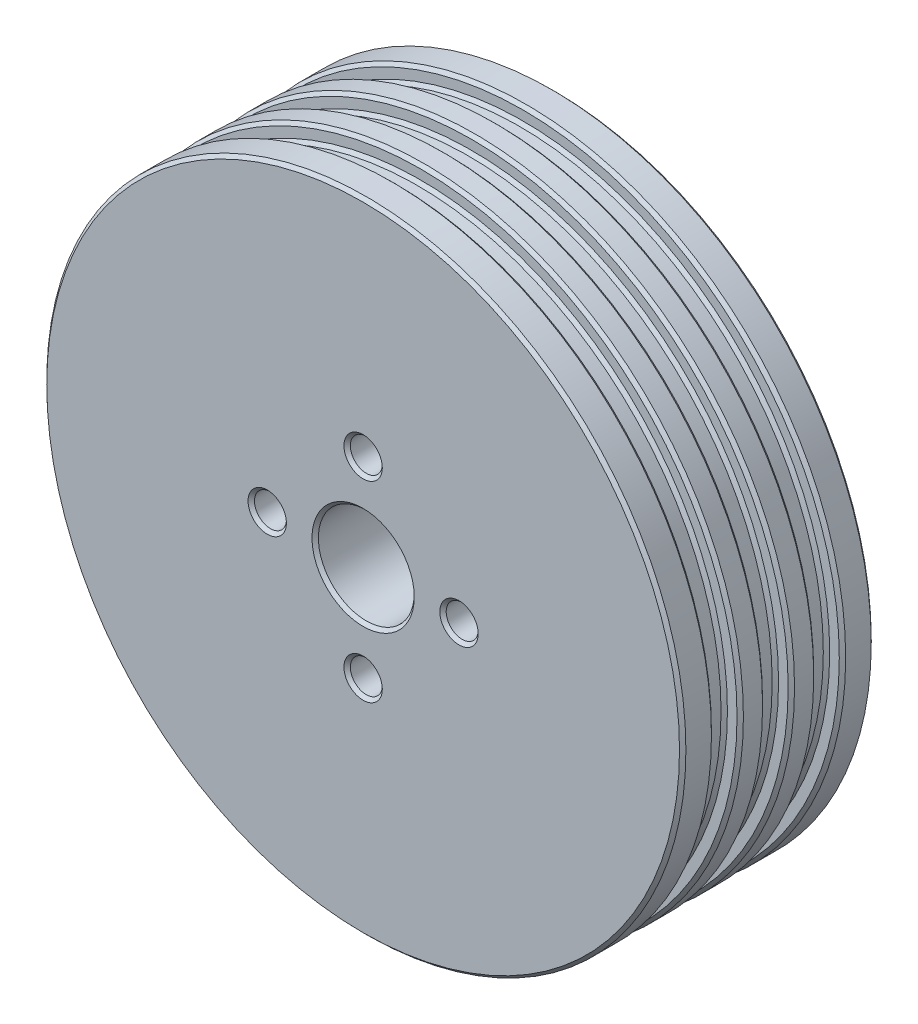
ISO-10303-21;
HEADER;
FILE_DESCRIPTION(('STEP AP214'),'2;1');
FILE_NAME('part.step','',(''),(''),'','','');
FILE_SCHEMA(('AUTOMOTIVE_DESIGN { 1 0 10303 214 1 1 1 1 }'));
ENDSEC;
DATA;
#1=APPLICATION_CONTEXT('core data for automotive mechanical design processes');
#2=APPLICATION_PROTOCOL_DEFINITION('international standard','automotive_design',2000,#1);
#3=PRODUCT_CONTEXT('',#1,'mechanical');
#4=PRODUCT('Part','Part','',(#3));
#5=PRODUCT_RELATED_PRODUCT_CATEGORY('part','',(#4));
#6=PRODUCT_DEFINITION_FORMATION('','',#4);
#7=PRODUCT_DEFINITION_CONTEXT('part definition',#1,'design');
#8=PRODUCT_DEFINITION('design','',#6,#7);
#9=PRODUCT_DEFINITION_SHAPE('','',#8);
#10=(LENGTH_UNIT() NAMED_UNIT(*) SI_UNIT(.MILLI.,.METRE.));
#11=(NAMED_UNIT(*) PLANE_ANGLE_UNIT() SI_UNIT($,.RADIAN.));
#12=(NAMED_UNIT(*) SI_UNIT($,.STERADIAN.) SOLID_ANGLE_UNIT());
#13=UNCERTAINTY_MEASURE_WITH_UNIT(LENGTH_MEASURE(1.E-05),#10,'distance_accuracy_value','');
#14=(GEOMETRIC_REPRESENTATION_CONTEXT(3) GLOBAL_UNCERTAINTY_ASSIGNED_CONTEXT((#13)) GLOBAL_UNIT_ASSIGNED_CONTEXT((#10,
#11,#12)) REPRESENTATION_CONTEXT('',''));
#15=CARTESIAN_POINT('',(0.,0.,0.));
#16=DIRECTION('',(0.,0.,1.));
#17=DIRECTION('',(1.,0.,0.));
#18=AXIS2_PLACEMENT_3D('',#15,#16,#17);
#19=CARTESIAN_POINT('',(0.,0.,34.));
#20=DIRECTION('',(0.,0.,1.));
#21=DIRECTION('',(1.,0.,0.));
#22=AXIS2_PLACEMENT_3D('',#19,#20,#21);
#23=PLANE('',#22);
#24=CARTESIAN_POINT('',(0.,0.,34.));
#25=DIRECTION('',(0.,0.,1.));
#26=DIRECTION('',(1.,0.,0.));
#27=AXIS2_PLACEMENT_3D('',#24,#25,#26);
#28=CIRCLE('',#27,99.);
#29=CARTESIAN_POINT('',(99.,0.,34.));
#30=VERTEX_POINT('',#29);
#31=EDGE_CURVE('E19',#30,#30,#28,.T.);
#32=ORIENTED_EDGE('',*,*,#31,.F.);
#33=EDGE_LOOP('',(#32));
#34=FACE_BOUND('',#33,.T.);
#35=CARTESIAN_POINT('',(0.,0.,34.));
#36=DIRECTION('',(0.,0.,1.));
#37=DIRECTION('',(1.,0.,0.));
#38=AXIS2_PLACEMENT_3D('',#35,#36,#37);
#39=CIRCLE('',#38,96.);
#40=CARTESIAN_POINT('',(96.,0.,34.));
#41=VERTEX_POINT('',#40);
#42=EDGE_CURVE('E42',#41,#41,#39,.T.);
#43=ORIENTED_EDGE('',*,*,#42,.T.);
#44=EDGE_LOOP('',(#43));
#45=FACE_BOUND('',#44,.T.);
#46=ADVANCED_FACE('F16',(#34,#45),#23,.F.);
#47=CARTESIAN_POINT('',(0.,0.,35.));
#48=DIRECTION('',(0.,0.,1.));
#49=DIRECTION('',(1.,0.,0.));
#50=AXIS2_PLACEMENT_3D('',#47,#48,#49);
#51=CONICAL_SURFACE('',#50,100.,0.785398163397);
#52=ORIENTED_EDGE('',*,*,#31,.T.);
#53=DIRECTION('',(-0.707106781186548,0.,-0.707106781186548));
#54=VECTOR('',#53,1.);
#55=CARTESIAN_POINT('',(100.,0.,35.));
#56=LINE('',#55,#54);
#57=CARTESIAN_POINT('',(100.,0.,35.));
#58=VERTEX_POINT('',#57);
#59=EDGE_CURVE('E10',#58,#30,#56,.T.);
#60=ORIENTED_EDGE('',*,*,#59,.F.);
#61=CARTESIAN_POINT('',(0.,0.,35.));
#62=DIRECTION('',(0.,0.,1.));
#63=DIRECTION('',(1.,0.,0.));
#64=AXIS2_PLACEMENT_3D('',#61,#62,#63);
#65=CIRCLE('',#64,100.);
#66=EDGE_CURVE('E485',#58,#58,#65,.T.);
#67=ORIENTED_EDGE('',*,*,#66,.F.);
#68=ORIENTED_EDGE('',*,*,#59,.T.);
#69=EDGE_LOOP('',(#52,#60,#67,#68));
#70=FACE_BOUND('',#69,.T.);
#71=ADVANCED_FACE('F520',(#70),#51,.T.);
#72=CARTESIAN_POINT('',(0.,0.,33.));
#73=DIRECTION('',(0.,0.,1.));
#74=DIRECTION('',(1.,0.,0.));
#75=AXIS2_PLACEMENT_3D('',#72,#73,#74);
#76=CONICAL_SURFACE('',#75,95.,0.785398163397);
#77=DIRECTION('',(0.707106781186548,0.,0.707106781186548));
#78=VECTOR('',#77,1.);
#79=CARTESIAN_POINT('',(95.,0.,33.));
#80=LINE('',#79,#78);
#81=CARTESIAN_POINT('',(95.,0.,33.));
#82=VERTEX_POINT('',#81);
#83=EDGE_CURVE('E288',#82,#41,#80,.T.);
#84=ORIENTED_EDGE('',*,*,#83,.F.);
#85=CARTESIAN_POINT('',(0.,0.,33.));
#86=DIRECTION('',(0.,0.,1.));
#87=DIRECTION('',(1.,0.,0.));
#88=AXIS2_PLACEMENT_3D('',#85,#86,#87);
#89=CIRCLE('',#88,95.);
#90=EDGE_CURVE('E253',#82,#82,#89,.T.);
#91=ORIENTED_EDGE('',*,*,#90,.T.);
#92=ORIENTED_EDGE('',*,*,#83,.T.);
#93=ORIENTED_EDGE('',*,*,#42,.F.);
#94=EDGE_LOOP('',(#84,#91,#92,#93));
#95=FACE_BOUND('',#94,.T.);
#96=ADVANCED_FACE('F743',(#95),#76,.T.);
#97=CARTESIAN_POINT('',(0.,0.,34.));
#98=DIRECTION('',(0.,0.,1.));
#99=DIRECTION('',(1.,0.,0.));
#100=AXIS2_PLACEMENT_3D('',#97,#98,#99);
#101=CYLINDRICAL_SURFACE('',#100,100.);
#102=DIRECTION('',(0.,0.,1.));
#103=VECTOR('',#102,1.);
#104=CARTESIAN_POINT('',(100.,0.,34.));
#105=LINE('',#104,#103);
#106=CARTESIAN_POINT('',(100.,0.,41.));
#107=VERTEX_POINT('',#106);
#108=EDGE_CURVE('E256',#58,#107,#105,.T.);
#109=ORIENTED_EDGE('',*,*,#108,.F.);
#110=ORIENTED_EDGE('',*,*,#66,.T.);
#111=ORIENTED_EDGE('',*,*,#108,.T.);
#112=CARTESIAN_POINT('',(0.,0.,41.));
#113=DIRECTION('',(0.,0.,1.));
#114=DIRECTION('',(1.,0.,0.));
#115=AXIS2_PLACEMENT_3D('',#112,#113,#114);
#116=CIRCLE('',#115,100.);
#117=EDGE_CURVE('E448',#107,#107,#116,.T.);
#118=ORIENTED_EDGE('',*,*,#117,.F.);
#119=EDGE_LOOP('',(#109,#110,#111,#118));
#120=FACE_BOUND('',#119,.T.);
#121=ADVANCED_FACE('F518',(#120),#101,.T.);
#122=CARTESIAN_POINT('',(0.,0.,26.));
#123=DIRECTION('',(0.,0.,1.));
#124=DIRECTION('',(1.,0.,0.));
#125=AXIS2_PLACEMENT_3D('',#122,#123,#124);
#126=CYLINDRICAL_SURFACE('',#125,95.);
#127=DIRECTION('',(0.,0.,1.));
#128=VECTOR('',#127,1.);
#129=CARTESIAN_POINT('',(95.,0.,26.));
#130=LINE('',#129,#128);
#131=CARTESIAN_POINT('',(95.,0.,27.));
#132=VERTEX_POINT('',#131);
#133=EDGE_CURVE('E257',#132,#82,#130,.T.);
#134=ORIENTED_EDGE('',*,*,#133,.F.);
#135=CARTESIAN_POINT('',(0.,0.,27.));
#136=DIRECTION('',(0.,0.,1.));
#137=DIRECTION('',(1.,0.,0.));
#138=AXIS2_PLACEMENT_3D('',#135,#136,#137);
#139=CIRCLE('',#138,95.);
#140=EDGE_CURVE('E268',#132,#132,#139,.T.);
#141=ORIENTED_EDGE('',*,*,#140,.T.);
#142=ORIENTED_EDGE('',*,*,#133,.T.);
#143=ORIENTED_EDGE('',*,*,#90,.F.);
#144=EDGE_LOOP('',(#134,#141,#142,#143));
#145=FACE_BOUND('',#144,.T.);
#146=ADVANCED_FACE('F884',(#145),#126,.T.);
#147=CARTESIAN_POINT('',(0.,0.,41.));
#148=DIRECTION('',(0.,0.,-1.));
#149=DIRECTION('',(1.,0.,0.));
#150=AXIS2_PLACEMENT_3D('',#147,#148,#149);
#151=CONICAL_SURFACE('',#150,100.,0.785398163397);
#152=ORIENTED_EDGE('',*,*,#117,.T.);
#153=DIRECTION('',(0.707106781186548,0.,-0.707106781186548));
#154=VECTOR('',#153,1.);
#155=CARTESIAN_POINT('',(100.,0.,41.));
#156=LINE('',#155,#154);
#157=CARTESIAN_POINT('',(99.,0.,42.));
#158=VERTEX_POINT('',#157);
#159=EDGE_CURVE('E452',#158,#107,#156,.T.);
#160=ORIENTED_EDGE('',*,*,#159,.F.);
#161=CARTESIAN_POINT('',(0.,0.,42.));
#162=DIRECTION('',(0.,0.,1.));
#163=DIRECTION('',(1.,0.,0.));
#164=AXIS2_PLACEMENT_3D('',#161,#162,#163);
#165=CIRCLE('',#164,99.);
#166=EDGE_CURVE('E269',#158,#158,#165,.T.);
#167=ORIENTED_EDGE('',*,*,#166,.F.);
#168=ORIENTED_EDGE('',*,*,#159,.T.);
#169=EDGE_LOOP('',(#152,#160,#167,#168));
#170=FACE_BOUND('',#169,.T.);
#171=ADVANCED_FACE('F875',(#170),#151,.T.);
#172=CARTESIAN_POINT('',(0.,0.,27.));
#173=DIRECTION('',(0.,0.,-1.));
#174=DIRECTION('',(1.,0.,0.));
#175=AXIS2_PLACEMENT_3D('',#172,#173,#174);
#176=CONICAL_SURFACE('',#175,95.,0.785398163397);
#177=DIRECTION('',(-0.707106781186548,0.,0.707106781186548));
#178=VECTOR('',#177,1.);
#179=CARTESIAN_POINT('',(95.,0.,27.));
#180=LINE('',#179,#178);
#181=CARTESIAN_POINT('',(96.,0.,26.));
#182=VERTEX_POINT('',#181);
#183=EDGE_CURVE('E264',#182,#132,#180,.T.);
#184=ORIENTED_EDGE('',*,*,#183,.F.);
#185=CARTESIAN_POINT('',(0.,0.,26.));
#186=DIRECTION('',(0.,0.,1.));
#187=DIRECTION('',(1.,0.,0.));
#188=AXIS2_PLACEMENT_3D('',#185,#186,#187);
#189=CIRCLE('',#188,96.);
#190=EDGE_CURVE('E489',#182,#182,#189,.T.);
#191=ORIENTED_EDGE('',*,*,#190,.T.);
#192=ORIENTED_EDGE('',*,*,#183,.T.);
#193=ORIENTED_EDGE('',*,*,#140,.F.);
#194=EDGE_LOOP('',(#184,#191,#192,#193));
#195=FACE_BOUND('',#194,.T.);
#196=ADVANCED_FACE('F866',(#195),#176,.T.);
#197=CARTESIAN_POINT('',(0.,0.,42.));
#198=DIRECTION('',(0.,0.,1.));
#199=DIRECTION('',(1.,0.,0.));
#200=AXIS2_PLACEMENT_3D('',#197,#198,#199);
#201=PLANE('',#200);
#202=ORIENTED_EDGE('',*,*,#166,.T.);
#203=EDGE_LOOP('',(#202));
#204=FACE_BOUND('',#203,.T.);
#205=CARTESIAN_POINT('',(0.,0.,42.));
#206=DIRECTION('',(0.,0.,1.));
#207=DIRECTION('',(1.,0.,0.));
#208=AXIS2_PLACEMENT_3D('',#205,#206,#207);
#209=CIRCLE('',#208,96.);
#210=CARTESIAN_POINT('',(96.,0.,42.));
#211=VERTEX_POINT('',#210);
#212=EDGE_CURVE('E492',#211,#211,#209,.T.);
#213=ORIENTED_EDGE('',*,*,#212,.F.);
#214=EDGE_LOOP('',(#213));
#215=FACE_BOUND('',#214,.T.);
#216=ADVANCED_FACE('F857',(#204,#215),#201,.T.);
#217=CARTESIAN_POINT('',(0.,0.,26.));
#218=DIRECTION('',(0.,0.,1.));
#219=DIRECTION('',(1.,0.,0.));
#220=AXIS2_PLACEMENT_3D('',#217,#218,#219);
#221=PLANE('',#220);
#222=ORIENTED_EDGE('',*,*,#190,.F.);
#223=EDGE_LOOP('',(#222));
#224=FACE_BOUND('',#223,.T.);
#225=CARTESIAN_POINT('',(0.,0.,26.));
#226=DIRECTION('',(0.,0.,1.));
#227=DIRECTION('',(1.,0.,0.));
#228=AXIS2_PLACEMENT_3D('',#225,#226,#227);
#229=CIRCLE('',#228,99.);
#230=CARTESIAN_POINT('',(99.,0.,26.));
#231=VERTEX_POINT('',#230);
#232=EDGE_CURVE('E481',#231,#231,#229,.T.);
#233=ORIENTED_EDGE('',*,*,#232,.T.);
#234=EDGE_LOOP('',(#233));
#235=FACE_BOUND('',#234,.T.);
#236=ADVANCED_FACE('F848',(#224,#235),#221,.T.);
#237=CARTESIAN_POINT('',(0.,0.,43.));
#238=DIRECTION('',(0.,0.,-1.));
#239=DIRECTION('',(1.,0.,0.));
#240=AXIS2_PLACEMENT_3D('',#237,#238,#239);
#241=CONICAL_SURFACE('',#240,95.,0.785398163397);
#242=ORIENTED_EDGE('',*,*,#212,.T.);
#243=DIRECTION('',(0.707106781186548,0.,-0.707106781186548));
#244=VECTOR('',#243,1.);
#245=CARTESIAN_POINT('',(95.,0.,43.));
#246=LINE('',#245,#244);
#247=CARTESIAN_POINT('',(95.,0.,43.));
#248=VERTEX_POINT('',#247);
#249=EDGE_CURVE('E496',#248,#211,#246,.T.);
#250=ORIENTED_EDGE('',*,*,#249,.F.);
#251=CARTESIAN_POINT('',(0.,0.,43.));
#252=DIRECTION('',(0.,0.,1.));
#253=DIRECTION('',(1.,0.,0.));
#254=AXIS2_PLACEMENT_3D('',#251,#252,#253);
#255=CIRCLE('',#254,95.);
#256=EDGE_CURVE('E473',#248,#248,#255,.T.);
#257=ORIENTED_EDGE('',*,*,#256,.F.);
#258=ORIENTED_EDGE('',*,*,#249,.T.);
#259=EDGE_LOOP('',(#242,#250,#257,#258));
#260=FACE_BOUND('',#259,.T.);
#261=ADVANCED_FACE('F839',(#260),#241,.T.);
#262=CARTESIAN_POINT('',(0.,0.,25.));
#263=DIRECTION('',(0.,0.,-1.));
#264=DIRECTION('',(1.,0.,0.));
#265=AXIS2_PLACEMENT_3D('',#262,#263,#264);
#266=CONICAL_SURFACE('',#265,100.,0.785398163397);
#267=DIRECTION('',(-0.707106781186548,0.,0.707106781186548));
#268=VECTOR('',#267,1.);
#269=CARTESIAN_POINT('',(100.,0.,25.));
#270=LINE('',#269,#268);
#271=CARTESIAN_POINT('',(100.,0.,25.));
#272=VERTEX_POINT('',#271);
#273=EDGE_CURVE('E477',#272,#231,#270,.T.);
#274=ORIENTED_EDGE('',*,*,#273,.F.);
#275=CARTESIAN_POINT('',(0.,0.,25.));
#276=DIRECTION('',(0.,0.,1.));
#277=DIRECTION('',(1.,0.,0.));
#278=AXIS2_PLACEMENT_3D('',#275,#276,#277);
#279=CIRCLE('',#278,100.);
#280=EDGE_CURVE('E325',#272,#272,#279,.T.);
#281=ORIENTED_EDGE('',*,*,#280,.T.);
#282=ORIENTED_EDGE('',*,*,#273,.T.);
#283=ORIENTED_EDGE('',*,*,#232,.F.);
#284=EDGE_LOOP('',(#274,#281,#282,#283));
#285=FACE_BOUND('',#284,.T.);
#286=ADVANCED_FACE('F830',(#285),#266,.T.);
#287=CARTESIAN_POINT('',(0.,0.,42.));
#288=DIRECTION('',(0.,0.,1.));
#289=DIRECTION('',(1.,0.,0.));
#290=AXIS2_PLACEMENT_3D('',#287,#288,#289);
#291=CYLINDRICAL_SURFACE('',#290,95.);
#292=DIRECTION('',(0.,0.,1.));
#293=VECTOR('',#292,1.);
#294=CARTESIAN_POINT('',(95.,0.,42.));
#295=LINE('',#294,#293);
#296=CARTESIAN_POINT('',(95.,0.,49.));
#297=VERTEX_POINT('',#296);
#298=EDGE_CURVE('E329',#248,#297,#295,.T.);
#299=ORIENTED_EDGE('',*,*,#298,.F.);
#300=ORIENTED_EDGE('',*,*,#256,.T.);
#301=ORIENTED_EDGE('',*,*,#298,.T.);
#302=CARTESIAN_POINT('',(0.,0.,49.));
#303=DIRECTION('',(0.,0.,1.));
#304=DIRECTION('',(1.,0.,0.));
#305=AXIS2_PLACEMENT_3D('',#302,#303,#304);
#306=CIRCLE('',#305,95.);
#307=EDGE_CURVE('E460',#297,#297,#306,.T.);
#308=ORIENTED_EDGE('',*,*,#307,.F.);
#309=EDGE_LOOP('',(#299,#300,#301,#308));
#310=FACE_BOUND('',#309,.T.);
#311=ADVANCED_FACE('F727',(#310),#291,.T.);
#312=CARTESIAN_POINT('',(0.,0.,18.));
#313=DIRECTION('',(0.,0.,1.));
#314=DIRECTION('',(1.,0.,0.));
#315=AXIS2_PLACEMENT_3D('',#312,#313,#314);
#316=CYLINDRICAL_SURFACE('',#315,100.);
#317=DIRECTION('',(0.,0.,1.));
#318=VECTOR('',#317,1.);
#319=CARTESIAN_POINT('',(100.,0.,18.));
#320=LINE('',#319,#318);
#321=CARTESIAN_POINT('',(100.,0.,19.));
#322=VERTEX_POINT('',#321);
#323=EDGE_CURVE('E330',#322,#272,#320,.T.);
#324=ORIENTED_EDGE('',*,*,#323,.F.);
#325=CARTESIAN_POINT('',(0.,0.,19.));
#326=DIRECTION('',(0.,0.,1.));
#327=DIRECTION('',(1.,0.,0.));
#328=AXIS2_PLACEMENT_3D('',#325,#326,#327);
#329=CIRCLE('',#328,100.);
#330=EDGE_CURVE('E456',#322,#322,#329,.T.);
#331=ORIENTED_EDGE('',*,*,#330,.T.);
#332=ORIENTED_EDGE('',*,*,#323,.T.);
#333=ORIENTED_EDGE('',*,*,#280,.F.);
#334=EDGE_LOOP('',(#324,#331,#332,#333));
#335=FACE_BOUND('',#334,.T.);
#336=ADVANCED_FACE('F721',(#335),#316,.T.);
#337=CARTESIAN_POINT('',(0.,0.,49.));
#338=DIRECTION('',(0.,0.,1.));
#339=DIRECTION('',(1.,0.,0.));
#340=AXIS2_PLACEMENT_3D('',#337,#338,#339);
#341=CONICAL_SURFACE('',#340,95.,0.785398163397);
#342=ORIENTED_EDGE('',*,*,#307,.T.);
#343=DIRECTION('',(-0.707106781186548,0.,-0.707106781186548));
#344=VECTOR('',#343,1.);
#345=CARTESIAN_POINT('',(95.,0.,49.));
#346=LINE('',#345,#344);
#347=CARTESIAN_POINT('',(96.,0.,50.));
#348=VERTEX_POINT('',#347);
#349=EDGE_CURVE('E464',#348,#297,#346,.T.);
#350=ORIENTED_EDGE('',*,*,#349,.F.);
#351=CARTESIAN_POINT('',(0.,0.,50.));
#352=DIRECTION('',(0.,0.,1.));
#353=DIRECTION('',(1.,0.,0.));
#354=AXIS2_PLACEMENT_3D('',#351,#352,#353);
#355=CIRCLE('',#354,96.);
#356=EDGE_CURVE('E443',#348,#348,#355,.T.);
#357=ORIENTED_EDGE('',*,*,#356,.F.);
#358=ORIENTED_EDGE('',*,*,#349,.T.);
#359=EDGE_LOOP('',(#342,#350,#357,#358));
#360=FACE_BOUND('',#359,.T.);
#361=ADVANCED_FACE('F726',(#360),#341,.T.);
#362=CARTESIAN_POINT('',(0.,0.,19.));
#363=DIRECTION('',(0.,0.,1.));
#364=DIRECTION('',(1.,0.,0.));
#365=AXIS2_PLACEMENT_3D('',#362,#363,#364);
#366=CONICAL_SURFACE('',#365,100.,0.785398163397);
#367=DIRECTION('',(0.707106781186548,0.,0.707106781186548));
#368=VECTOR('',#367,1.);
#369=CARTESIAN_POINT('',(100.,0.,19.));
#370=LINE('',#369,#368);
#371=CARTESIAN_POINT('',(99.,0.,18.));
#372=VERTEX_POINT('',#371);
#373=EDGE_CURVE('E447',#372,#322,#370,.T.);
#374=ORIENTED_EDGE('',*,*,#373,.F.);
#375=CARTESIAN_POINT('',(0.,0.,18.));
#376=DIRECTION('',(0.,0.,1.));
#377=DIRECTION('',(1.,0.,0.));
#378=AXIS2_PLACEMENT_3D('',#375,#376,#377);
#379=CIRCLE('',#378,99.);
#380=EDGE_CURVE('E334',#372,#372,#379,.T.);
#381=ORIENTED_EDGE('',*,*,#380,.T.);
#382=ORIENTED_EDGE('',*,*,#373,.T.);
#383=ORIENTED_EDGE('',*,*,#330,.F.);
#384=EDGE_LOOP('',(#374,#381,#382,#383));
#385=FACE_BOUND('',#384,.T.);
#386=ADVANCED_FACE('F807',(#385),#366,.T.);
#387=CARTESIAN_POINT('',(0.,0.,50.));
#388=DIRECTION('',(0.,0.,1.));
#389=DIRECTION('',(1.,0.,0.));
#390=AXIS2_PLACEMENT_3D('',#387,#388,#389);
#391=PLANE('',#390);
#392=ORIENTED_EDGE('',*,*,#356,.T.);
#393=EDGE_LOOP('',(#392));
#394=FACE_BOUND('',#393,.T.);
#395=CARTESIAN_POINT('',(0.,0.,50.));
#396=DIRECTION('',(0.,0.,1.));
#397=DIRECTION('',(1.,0.,0.));
#398=AXIS2_PLACEMENT_3D('',#395,#396,#397);
#399=CIRCLE('',#398,99.);
#400=CARTESIAN_POINT('',(99.,0.,50.));
#401=VERTEX_POINT('',#400);
#402=EDGE_CURVE('E335',#401,#401,#399,.T.);
#403=ORIENTED_EDGE('',*,*,#402,.F.);
#404=EDGE_LOOP('',(#403));
#405=FACE_BOUND('',#404,.T.);
#406=ADVANCED_FACE('F583',(#394,#405),#391,.F.);
#407=CARTESIAN_POINT('',(0.,0.,18.));
#408=DIRECTION('',(0.,0.,1.));
#409=DIRECTION('',(1.,0.,0.));
#410=AXIS2_PLACEMENT_3D('',#407,#408,#409);
#411=PLANE('',#410);
#412=ORIENTED_EDGE('',*,*,#380,.F.);
#413=EDGE_LOOP('',(#412));
#414=FACE_BOUND('',#413,.T.);
#415=CARTESIAN_POINT('',(0.,0.,18.));
#416=DIRECTION('',(0.,0.,1.));
#417=DIRECTION('',(1.,0.,0.));
#418=AXIS2_PLACEMENT_3D('',#415,#416,#417);
#419=CIRCLE('',#418,96.);
#420=CARTESIAN_POINT('',(96.,0.,18.));
#421=VERTEX_POINT('',#420);
#422=EDGE_CURVE('E433',#421,#421,#419,.T.);
#423=ORIENTED_EDGE('',*,*,#422,.T.);
#424=EDGE_LOOP('',(#423));
#425=FACE_BOUND('',#424,.T.);
#426=ADVANCED_FACE('F577',(#414,#425),#411,.F.);
#427=CARTESIAN_POINT('',(0.,0.,51.));
#428=DIRECTION('',(0.,0.,1.));
#429=DIRECTION('',(1.,0.,0.));
#430=AXIS2_PLACEMENT_3D('',#427,#428,#429);
#431=CONICAL_SURFACE('',#430,100.,0.785398163397);
#432=ORIENTED_EDGE('',*,*,#402,.T.);
#433=DIRECTION('',(-0.707106781186548,0.,-0.707106781186548));
#434=VECTOR('',#433,1.);
#435=CARTESIAN_POINT('',(100.,0.,51.));
#436=LINE('',#435,#434);
#437=CARTESIAN_POINT('',(100.,0.,51.));
#438=VERTEX_POINT('',#437);
#439=EDGE_CURVE('E331',#438,#401,#436,.T.);
#440=ORIENTED_EDGE('',*,*,#439,.F.);
#441=CARTESIAN_POINT('',(0.,0.,51.));
#442=DIRECTION('',(0.,0.,1.));
#443=DIRECTION('',(1.,0.,0.));
#444=AXIS2_PLACEMENT_3D('',#441,#442,#443);
#445=CIRCLE('',#444,100.);
#446=EDGE_CURVE('E426',#438,#438,#445,.T.);
#447=ORIENTED_EDGE('',*,*,#446,.F.);
#448=ORIENTED_EDGE('',*,*,#439,.T.);
#449=EDGE_LOOP('',(#432,#440,#447,#448));
#450=FACE_BOUND('',#449,.T.);
#451=ADVANCED_FACE('F582',(#450),#431,.T.);
#452=CARTESIAN_POINT('',(0.,0.,17.));
#453=DIRECTION('',(0.,0.,1.));
#454=DIRECTION('',(1.,0.,0.));
#455=AXIS2_PLACEMENT_3D('',#452,#453,#454);
#456=CONICAL_SURFACE('',#455,95.,0.785398163397);
#457=DIRECTION('',(0.707106781186548,0.,0.707106781186548));
#458=VECTOR('',#457,1.);
#459=CARTESIAN_POINT('',(95.,0.,17.));
#460=LINE('',#459,#458);
#461=CARTESIAN_POINT('',(95.,0.,17.));
#462=VERTEX_POINT('',#461);
#463=EDGE_CURVE('E430',#462,#421,#460,.T.);
#464=ORIENTED_EDGE('',*,*,#463,.F.);
#465=CARTESIAN_POINT('',(0.,0.,17.));
#466=DIRECTION('',(0.,0.,1.));
#467=DIRECTION('',(1.,0.,0.));
#468=AXIS2_PLACEMENT_3D('',#465,#466,#467);
#469=CIRCLE('',#468,95.);
#470=EDGE_CURVE('E304',#462,#462,#469,.T.);
#471=ORIENTED_EDGE('',*,*,#470,.T.);
#472=ORIENTED_EDGE('',*,*,#463,.T.);
#473=ORIENTED_EDGE('',*,*,#422,.F.);
#474=EDGE_LOOP('',(#464,#471,#472,#473));
#475=FACE_BOUND('',#474,.T.);
#476=ADVANCED_FACE('F784',(#475),#456,.T.);
#477=CARTESIAN_POINT('',(0.,0.,50.));
#478=DIRECTION('',(0.,0.,1.));
#479=DIRECTION('',(1.,0.,0.));
#480=AXIS2_PLACEMENT_3D('',#477,#478,#479);
#481=CYLINDRICAL_SURFACE('',#480,100.);
#482=DIRECTION('',(0.,0.,1.));
#483=VECTOR('',#482,1.);
#484=CARTESIAN_POINT('',(100.,0.,50.));
#485=LINE('',#484,#483);
#486=CARTESIAN_POINT('',(100.,0.,59.));
#487=VERTEX_POINT('',#486);
#488=EDGE_CURVE('E251',#438,#487,#485,.T.);
#489=ORIENTED_EDGE('',*,*,#488,.F.);
#490=ORIENTED_EDGE('',*,*,#446,.T.);
#491=ORIENTED_EDGE('',*,*,#488,.T.);
#492=CARTESIAN_POINT('',(0.,0.,59.));
#493=DIRECTION('',(0.,0.,1.));
#494=DIRECTION('',(1.,0.,0.));
#495=AXIS2_PLACEMENT_3D('',#492,#493,#494);
#496=CIRCLE('',#495,100.);
#497=EDGE_CURVE('E316',#487,#487,#496,.T.);
#498=ORIENTED_EDGE('',*,*,#497,.F.);
#499=EDGE_LOOP('',(#489,#490,#491,#498));
#500=FACE_BOUND('',#499,.T.);
#501=ADVANCED_FACE('F775',(#500),#481,.T.);
#502=CARTESIAN_POINT('',(0.,0.,10.));
#503=DIRECTION('',(0.,0.,1.));
#504=DIRECTION('',(1.,0.,0.));
#505=AXIS2_PLACEMENT_3D('',#502,#503,#504);
#506=CYLINDRICAL_SURFACE('',#505,95.);
#507=DIRECTION('',(0.,0.,1.));
#508=VECTOR('',#507,1.);
#509=CARTESIAN_POINT('',(95.,0.,10.));
#510=LINE('',#509,#508);
#511=CARTESIAN_POINT('',(95.,0.,11.));
#512=VERTEX_POINT('',#511);
#513=EDGE_CURVE('E308',#512,#462,#510,.T.);
#514=ORIENTED_EDGE('',*,*,#513,.F.);
#515=CARTESIAN_POINT('',(0.,0.,11.));
#516=DIRECTION('',(0.,0.,1.));
#517=DIRECTION('',(1.,0.,0.));
#518=AXIS2_PLACEMENT_3D('',#515,#516,#517);
#519=CIRCLE('',#518,95.);
#520=EDGE_CURVE('E312',#512,#512,#519,.T.);
#521=ORIENTED_EDGE('',*,*,#520,.T.);
#522=ORIENTED_EDGE('',*,*,#513,.T.);
#523=ORIENTED_EDGE('',*,*,#470,.F.);
#524=EDGE_LOOP('',(#514,#521,#522,#523));
#525=FACE_BOUND('',#524,.T.);
#526=ADVANCED_FACE('F766',(#525),#506,.T.);
#527=CARTESIAN_POINT('',(0.,0.,59.));
#528=DIRECTION('',(0.,0.,-1.));
#529=DIRECTION('',(1.,0.,0.));
#530=AXIS2_PLACEMENT_3D('',#527,#528,#529);
#531=CONICAL_SURFACE('',#530,100.,0.785398163397);
#532=ORIENTED_EDGE('',*,*,#497,.T.);
#533=DIRECTION('',(0.707106781186548,0.,-0.707106781186548));
#534=VECTOR('',#533,1.);
#535=CARTESIAN_POINT('',(100.,0.,59.));
#536=LINE('',#535,#534);
#537=CARTESIAN_POINT('',(99.,0.,60.));
#538=VERTEX_POINT('',#537);
#539=EDGE_CURVE('E419',#538,#487,#536,.T.);
#540=ORIENTED_EDGE('',*,*,#539,.F.);
#541=CARTESIAN_POINT('',(0.,0.,60.));
#542=DIRECTION('',(0.,0.,1.));
#543=DIRECTION('',(1.,0.,0.));
#544=AXIS2_PLACEMENT_3D('',#541,#542,#543);
#545=CIRCLE('',#544,99.);
#546=EDGE_CURVE('E274',#538,#538,#545,.T.);
#547=ORIENTED_EDGE('',*,*,#546,.F.);
#548=ORIENTED_EDGE('',*,*,#539,.T.);
#549=EDGE_LOOP('',(#532,#540,#547,#548));
#550=FACE_BOUND('',#549,.T.);
#551=ADVANCED_FACE('F757',(#550),#531,.T.);
#552=CARTESIAN_POINT('',(0.,0.,11.));
#553=DIRECTION('',(0.,0.,-1.));
#554=DIRECTION('',(1.,0.,0.));
#555=AXIS2_PLACEMENT_3D('',#552,#553,#554);
#556=CONICAL_SURFACE('',#555,95.,0.785398163397);
#557=DIRECTION('',(-0.707106781186548,0.,0.707106781186548));
#558=VECTOR('',#557,1.);
#559=CARTESIAN_POINT('',(95.,0.,11.));
#560=LINE('',#559,#558);
#561=CARTESIAN_POINT('',(96.,0.,10.));
#562=VERTEX_POINT('',#561);
#563=EDGE_CURVE('E278',#562,#512,#560,.T.);
#564=ORIENTED_EDGE('',*,*,#563,.F.);
#565=CARTESIAN_POINT('',(0.,0.,10.));
#566=DIRECTION('',(0.,0.,1.));
#567=DIRECTION('',(1.,0.,0.));
#568=AXIS2_PLACEMENT_3D('',#565,#566,#567);
#569=CIRCLE('',#568,96.);
#570=EDGE_CURVE('E279',#562,#562,#569,.T.);
#571=ORIENTED_EDGE('',*,*,#570,.T.);
#572=ORIENTED_EDGE('',*,*,#563,.T.);
#573=ORIENTED_EDGE('',*,*,#520,.F.);
#574=EDGE_LOOP('',(#564,#571,#572,#573));
#575=FACE_BOUND('',#574,.T.);
#576=ADVANCED_FACE('F737',(#575),#556,.T.);
#577=CARTESIAN_POINT('',(0.,0.,60.));
#578=DIRECTION('',(0.,0.,1.));
#579=DIRECTION('',(1.,0.,0.));
#580=AXIS2_PLACEMENT_3D('',#577,#578,#579);
#581=PLANE('',#580);
#582=ORIENTED_EDGE('',*,*,#546,.T.);
#583=EDGE_LOOP('',(#582));
#584=FACE_BOUND('',#583,.T.);
#585=CARTESIAN_POINT('',(0.,30.,60.));
#586=DIRECTION('',(0.,0.,-1.));
#587=DIRECTION('',(0.,1.,0.));
#588=AXIS2_PLACEMENT_3D('',#585,#586,#587);
#589=CIRCLE('',#588,6.);
#590=CARTESIAN_POINT('',(0.,36.,60.));
#591=VERTEX_POINT('',#590);
#592=EDGE_CURVE('E292',#591,#591,#589,.T.);
#593=ORIENTED_EDGE('',*,*,#592,.T.);
#594=EDGE_LOOP('',(#593));
#595=FACE_BOUND('',#594,.T.);
#596=CARTESIAN_POINT('',(-30.,0.,60.));
#597=DIRECTION('',(0.,0.,-1.));
#598=DIRECTION('',(-1.,0.,0.));
#599=AXIS2_PLACEMENT_3D('',#596,#597,#598);
#600=CIRCLE('',#599,6.);
#601=CARTESIAN_POINT('',(-36.,0.,60.));
#602=VERTEX_POINT('',#601);
#603=EDGE_CURVE('E345',#602,#602,#600,.T.);
#604=ORIENTED_EDGE('',*,*,#603,.T.);
#605=EDGE_LOOP('',(#604));
#606=FACE_BOUND('',#605,.T.);
#607=CARTESIAN_POINT('',(0.,0.,60.));
#608=DIRECTION('',(0.,0.,-1.));
#609=DIRECTION('',(1.,0.,0.));
#610=AXIS2_PLACEMENT_3D('',#607,#608,#609);
#611=CIRCLE('',#610,16.);
#612=CARTESIAN_POINT('',(16.,0.,60.));
#613=VERTEX_POINT('',#612);
#614=EDGE_CURVE('E340',#613,#613,#611,.T.);
#615=ORIENTED_EDGE('',*,*,#614,.T.);
#616=EDGE_LOOP('',(#615));
#617=FACE_BOUND('',#616,.T.);
#618=CARTESIAN_POINT('',(30.,0.,60.));
#619=DIRECTION('',(0.,0.,-1.));
#620=DIRECTION('',(1.,0.,0.));
#621=AXIS2_PLACEMENT_3D('',#618,#619,#620);
#622=CIRCLE('',#621,6.);
#623=CARTESIAN_POINT('',(36.,0.,60.));
#624=VERTEX_POINT('',#623);
#625=EDGE_CURVE('E341',#624,#624,#622,.T.);
#626=ORIENTED_EDGE('',*,*,#625,.T.);
#627=EDGE_LOOP('',(#626));
#628=FACE_BOUND('',#627,.T.);
#629=CARTESIAN_POINT('',(0.,-30.,60.));
#630=DIRECTION('',(0.,0.,-1.));
#631=DIRECTION('',(0.,-1.,0.));
#632=AXIS2_PLACEMENT_3D('',#629,#630,#631);
#633=CIRCLE('',#632,6.);
#634=CARTESIAN_POINT('',(0.,-36.,60.));
#635=VERTEX_POINT('',#634);
#636=EDGE_CURVE('E297',#635,#635,#633,.T.);
#637=ORIENTED_EDGE('',*,*,#636,.T.);
#638=EDGE_LOOP('',(#637));
#639=FACE_BOUND('',#638,.T.);
#640=ADVANCED_FACE('F618',(#584,#595,#606,#617,#628,#639),#581,.T.);
#641=CARTESIAN_POINT('',(0.,0.,10.));
#642=DIRECTION('',(0.,0.,1.));
#643=DIRECTION('',(1.,0.,0.));
#644=AXIS2_PLACEMENT_3D('',#641,#642,#643);
#645=PLANE('',#644);
#646=ORIENTED_EDGE('',*,*,#570,.F.);
#647=EDGE_LOOP('',(#646));
#648=FACE_BOUND('',#647,.T.);
#649=CARTESIAN_POINT('',(0.,0.,10.));
#650=DIRECTION('',(0.,0.,1.));
#651=DIRECTION('',(1.,0.,0.));
#652=AXIS2_PLACEMENT_3D('',#649,#650,#651);
#653=CIRCLE('',#652,99.);
#654=CARTESIAN_POINT('',(99.,0.,10.));
#655=VERTEX_POINT('',#654);
#656=EDGE_CURVE('E298',#655,#655,#653,.T.);
#657=ORIENTED_EDGE('',*,*,#656,.T.);
#658=EDGE_LOOP('',(#657));
#659=FACE_BOUND('',#658,.T.);
#660=ADVANCED_FACE('F612',(#648,#659),#645,.T.);
#661=CARTESIAN_POINT('',(0.,30.,59.));
#662=DIRECTION('',(0.,0.,1.));
#663=DIRECTION('',(0.,1.,0.));
#664=AXIS2_PLACEMENT_3D('',#661,#662,#663);
#665=CONICAL_SURFACE('',#664,5.,0.785398163397);
#666=DIRECTION('',(0.,0.707106781186548,0.707106781186548));
#667=VECTOR('',#666,1.);
#668=CARTESIAN_POINT('',(0.,35.,59.));
#669=LINE('',#668,#667);
#670=CARTESIAN_POINT('',(0.,35.,59.));
#671=VERTEX_POINT('',#670);
#672=EDGE_CURVE('E348',#671,#591,#669,.T.);
#673=ORIENTED_EDGE('',*,*,#672,.F.);
#674=CARTESIAN_POINT('',(0.,30.,59.));
#675=DIRECTION('',(0.,0.,-1.));
#676=DIRECTION('',(0.,1.,0.));
#677=AXIS2_PLACEMENT_3D('',#674,#675,#676);
#678=CIRCLE('',#677,5.);
#679=EDGE_CURVE('E388',#671,#671,#678,.T.);
#680=ORIENTED_EDGE('',*,*,#679,.T.);
#681=ORIENTED_EDGE('',*,*,#672,.T.);
#682=ORIENTED_EDGE('',*,*,#592,.F.);
#683=EDGE_LOOP('',(#673,#680,#681,#682));
#684=FACE_BOUND('',#683,.T.);
#685=ADVANCED_FACE('F617',(#684),#665,.F.);
#686=CARTESIAN_POINT('',(-30.,0.,59.));
#687=DIRECTION('',(0.,0.,1.));
#688=DIRECTION('',(-1.,0.,0.));
#689=AXIS2_PLACEMENT_3D('',#686,#687,#688);
#690=CONICAL_SURFACE('',#689,5.,0.785398163397);
#691=DIRECTION('',(-0.707106781186548,0.,0.707106781186548));
#692=VECTOR('',#691,1.);
#693=CARTESIAN_POINT('',(-35.,0.,59.));
#694=LINE('',#693,#692);
#695=CARTESIAN_POINT('',(-35.,0.,59.));
#696=VERTEX_POINT('',#695);
#697=EDGE_CURVE('E349',#696,#602,#694,.T.);
#698=ORIENTED_EDGE('',*,*,#697,.F.);
#699=CARTESIAN_POINT('',(-30.,0.,59.));
#700=DIRECTION('',(0.,0.,-1.));
#701=DIRECTION('',(-1.,0.,0.));
#702=AXIS2_PLACEMENT_3D('',#699,#700,#701);
#703=CIRCLE('',#702,5.);
#704=EDGE_CURVE('E383',#696,#696,#703,.T.);
#705=ORIENTED_EDGE('',*,*,#704,.T.);
#706=ORIENTED_EDGE('',*,*,#697,.T.);
#707=ORIENTED_EDGE('',*,*,#603,.F.);
#708=EDGE_LOOP('',(#698,#705,#706,#707));
#709=FACE_BOUND('',#708,.T.);
#710=ADVANCED_FACE('F701',(#709),#690,.F.);
#711=CARTESIAN_POINT('',(0.,0.,59.));
#712=DIRECTION('',(0.,0.,1.));
#713=DIRECTION('',(1.,0.,0.));
#714=AXIS2_PLACEMENT_3D('',#711,#712,#713);
#715=CONICAL_SURFACE('',#714,15.,0.785398163397);
#716=DIRECTION('',(0.707106781186548,0.,0.707106781186548));
#717=VECTOR('',#716,1.);
#718=CARTESIAN_POINT('',(15.,0.,59.));
#719=LINE('',#718,#717);
#720=CARTESIAN_POINT('',(15.,0.,59.));
#721=VERTEX_POINT('',#720);
#722=EDGE_CURVE('E336',#721,#613,#719,.T.);
#723=ORIENTED_EDGE('',*,*,#722,.F.);
#724=CARTESIAN_POINT('',(0.,0.,59.));
#725=DIRECTION('',(0.,0.,-1.));
#726=DIRECTION('',(1.,0.,0.));
#727=AXIS2_PLACEMENT_3D('',#724,#725,#726);
#728=CIRCLE('',#727,15.);
#729=EDGE_CURVE('E375',#721,#721,#728,.T.);
#730=ORIENTED_EDGE('',*,*,#729,.T.);
#731=ORIENTED_EDGE('',*,*,#722,.T.);
#732=ORIENTED_EDGE('',*,*,#614,.F.);
#733=EDGE_LOOP('',(#723,#730,#731,#732));
#734=FACE_BOUND('',#733,.T.);
#735=ADVANCED_FACE('F605',(#734),#715,.F.);
#736=CARTESIAN_POINT('',(30.,0.,59.));
#737=DIRECTION('',(0.,0.,1.));
#738=DIRECTION('',(1.,0.,0.));
#739=AXIS2_PLACEMENT_3D('',#736,#737,#738);
#740=CONICAL_SURFACE('',#739,5.,0.785398163397);
#741=DIRECTION('',(0.707106781186548,0.,0.707106781186548));
#742=VECTOR('',#741,1.);
#743=CARTESIAN_POINT('',(35.,0.,59.));
#744=LINE('',#743,#742);
#745=CARTESIAN_POINT('',(35.,0.,59.));
#746=VERTEX_POINT('',#745);
#747=EDGE_CURVE('E403',#746,#624,#744,.T.);
#748=ORIENTED_EDGE('',*,*,#747,.F.);
#749=CARTESIAN_POINT('',(30.,0.,59.));
#750=DIRECTION('',(0.,0.,-1.));
#751=DIRECTION('',(1.,0.,0.));
#752=AXIS2_PLACEMENT_3D('',#749,#750,#751);
#753=CIRCLE('',#752,5.);
#754=EDGE_CURVE('E367',#746,#746,#753,.T.);
#755=ORIENTED_EDGE('',*,*,#754,.T.);
#756=ORIENTED_EDGE('',*,*,#747,.T.);
#757=ORIENTED_EDGE('',*,*,#625,.F.);
#758=EDGE_LOOP('',(#748,#755,#756,#757));
#759=FACE_BOUND('',#758,.T.);
#760=ADVANCED_FACE('F599',(#759),#740,.F.);
#761=CARTESIAN_POINT('',(0.,-30.,59.));
#762=DIRECTION('',(0.,0.,1.));
#763=DIRECTION('',(0.,-1.,0.));
#764=AXIS2_PLACEMENT_3D('',#761,#762,#763);
#765=CONICAL_SURFACE('',#764,5.,0.785398163397);
#766=DIRECTION('',(0.,-0.707106781186548,0.707106781186548));
#767=VECTOR('',#766,1.);
#768=CARTESIAN_POINT('',(0.,-35.,59.));
#769=LINE('',#768,#767);
#770=CARTESIAN_POINT('',(0.,-35.,59.));
#771=VERTEX_POINT('',#770);
#772=EDGE_CURVE('E293',#771,#635,#769,.T.);
#773=ORIENTED_EDGE('',*,*,#772,.F.);
#774=CARTESIAN_POINT('',(0.,-30.,59.));
#775=DIRECTION('',(0.,0.,-1.));
#776=DIRECTION('',(0.,-1.,0.));
#777=AXIS2_PLACEMENT_3D('',#774,#775,#776);
#778=CIRCLE('',#777,5.);
#779=EDGE_CURVE('E356',#771,#771,#778,.T.);
#780=ORIENTED_EDGE('',*,*,#779,.T.);
#781=ORIENTED_EDGE('',*,*,#772,.T.);
#782=ORIENTED_EDGE('',*,*,#636,.F.);
#783=EDGE_LOOP('',(#773,#780,#781,#782));
#784=FACE_BOUND('',#783,.T.);
#785=ADVANCED_FACE('F604',(#784),#765,.F.);
#786=CARTESIAN_POINT('',(0.,0.,9.));
#787=DIRECTION('',(0.,0.,-1.));
#788=DIRECTION('',(1.,0.,0.));
#789=AXIS2_PLACEMENT_3D('',#786,#787,#788);
#790=CONICAL_SURFACE('',#789,100.,0.785398163397);
#791=DIRECTION('',(-0.707106781186548,0.,0.707106781186548));
#792=VECTOR('',#791,1.);
#793=CARTESIAN_POINT('',(100.,0.,9.));
#794=LINE('',#793,#792);
#795=CARTESIAN_POINT('',(100.,0.,9.));
#796=VERTEX_POINT('',#795);
#797=EDGE_CURVE('E392',#796,#655,#794,.T.);
#798=ORIENTED_EDGE('',*,*,#797,.F.);
#799=CARTESIAN_POINT('',(0.,0.,9.));
#800=DIRECTION('',(0.,0.,1.));
#801=DIRECTION('',(1.,0.,0.));
#802=AXIS2_PLACEMENT_3D('',#799,#800,#801);
#803=CIRCLE('',#802,100.);
#804=EDGE_CURVE('E258',#796,#796,#803,.T.);
#805=ORIENTED_EDGE('',*,*,#804,.T.);
#806=ORIENTED_EDGE('',*,*,#797,.T.);
#807=ORIENTED_EDGE('',*,*,#656,.F.);
#808=EDGE_LOOP('',(#798,#805,#806,#807));
#809=FACE_BOUND('',#808,.T.);
#810=ADVANCED_FACE('F655',(#809),#790,.T.);
#811=CARTESIAN_POINT('',(0.,30.,0.));
#812=DIRECTION('',(0.,0.,-1.));
#813=DIRECTION('',(0.,1.,0.));
#814=AXIS2_PLACEMENT_3D('',#811,#812,#813);
#815=CYLINDRICAL_SURFACE('',#814,5.);
#816=DIRECTION('',(0.,0.,1.));
#817=VECTOR('',#816,1.);
#818=CARTESIAN_POINT('',(0.,35.,0.));
#819=LINE('',#818,#817);
#820=CARTESIAN_POINT('',(0.,35.,1.));
#821=VERTEX_POINT('',#820);
#822=EDGE_CURVE('E387',#821,#671,#819,.T.);
#823=ORIENTED_EDGE('',*,*,#822,.F.);
#824=CARTESIAN_POINT('',(0.,30.,1.));
#825=DIRECTION('',(0.,0.,1.));
#826=DIRECTION('',(0.,1.,0.));
#827=AXIS2_PLACEMENT_3D('',#824,#825,#826);
#828=CIRCLE('',#827,5.);
#829=EDGE_CURVE('E320',#821,#821,#828,.T.);
#830=ORIENTED_EDGE('',*,*,#829,.F.);
#831=ORIENTED_EDGE('',*,*,#822,.T.);
#832=ORIENTED_EDGE('',*,*,#679,.F.);
#833=EDGE_LOOP('',(#823,#830,#831,#832));
#834=FACE_BOUND('',#833,.T.);
#835=ADVANCED_FACE('F678',(#834),#815,.F.);
#836=CARTESIAN_POINT('',(-30.,0.,0.));
#837=DIRECTION('',(0.,0.,-1.));
#838=DIRECTION('',(-1.,0.,0.));
#839=AXIS2_PLACEMENT_3D('',#836,#837,#838);
#840=CYLINDRICAL_SURFACE('',#839,5.);
#841=DIRECTION('',(0.,0.,1.));
#842=VECTOR('',#841,1.);
#843=CARTESIAN_POINT('',(-35.,0.,0.));
#844=LINE('',#843,#842);
#845=CARTESIAN_POINT('',(-35.,0.,1.));
#846=VERTEX_POINT('',#845);
#847=EDGE_CURVE('E379',#846,#696,#844,.T.);
#848=ORIENTED_EDGE('',*,*,#847,.F.);
#849=CARTESIAN_POINT('',(-30.,0.,1.));
#850=DIRECTION('',(0.,0.,1.));
#851=DIRECTION('',(-1.,0.,0.));
#852=AXIS2_PLACEMENT_3D('',#849,#850,#851);
#853=CIRCLE('',#852,5.);
#854=EDGE_CURVE('E280',#846,#846,#853,.T.);
#855=ORIENTED_EDGE('',*,*,#854,.F.);
#856=ORIENTED_EDGE('',*,*,#847,.T.);
#857=ORIENTED_EDGE('',*,*,#704,.F.);
#858=EDGE_LOOP('',(#848,#855,#856,#857));
#859=FACE_BOUND('',#858,.T.);
#860=ADVANCED_FACE('F561',(#859),#840,.F.);
#861=CARTESIAN_POINT('',(0.,0.,0.));
#862=DIRECTION('',(0.,0.,-1.));
#863=DIRECTION('',(1.,0.,0.));
#864=AXIS2_PLACEMENT_3D('',#861,#862,#863);
#865=CYLINDRICAL_SURFACE('',#864,15.);
#866=DIRECTION('',(0.,0.,1.));
#867=VECTOR('',#866,1.);
#868=CARTESIAN_POINT('',(15.,0.,0.));
#869=LINE('',#868,#867);
#870=CARTESIAN_POINT('',(15.,0.,1.));
#871=VERTEX_POINT('',#870);
#872=EDGE_CURVE('E371',#871,#721,#869,.T.);
#873=ORIENTED_EDGE('',*,*,#872,.F.);
#874=CARTESIAN_POINT('',(0.,0.,1.));
#875=DIRECTION('',(0.,0.,1.));
#876=DIRECTION('',(1.,0.,0.));
#877=AXIS2_PLACEMENT_3D('',#874,#875,#876);
#878=CIRCLE('',#877,15.);
#879=EDGE_CURVE('E299',#871,#871,#878,.T.);
#880=ORIENTED_EDGE('',*,*,#879,.F.);
#881=ORIENTED_EDGE('',*,*,#872,.T.);
#882=ORIENTED_EDGE('',*,*,#729,.F.);
#883=EDGE_LOOP('',(#873,#880,#881,#882));
#884=FACE_BOUND('',#883,.T.);
#885=ADVANCED_FACE('F555',(#884),#865,.F.);
#886=CARTESIAN_POINT('',(30.,0.,0.));
#887=DIRECTION('',(0.,0.,-1.));
#888=DIRECTION('',(1.,0.,0.));
#889=AXIS2_PLACEMENT_3D('',#886,#887,#888);
#890=CYLINDRICAL_SURFACE('',#889,5.);
#891=DIRECTION('',(0.,0.,1.));
#892=VECTOR('',#891,1.);
#893=CARTESIAN_POINT('',(35.,0.,0.));
#894=LINE('',#893,#892);
#895=CARTESIAN_POINT('',(35.,0.,1.));
#896=VERTEX_POINT('',#895);
#897=EDGE_CURVE('E360',#896,#746,#894,.T.);
#898=ORIENTED_EDGE('',*,*,#897,.F.);
#899=CARTESIAN_POINT('',(30.,0.,1.));
#900=DIRECTION('',(0.,0.,1.));
#901=DIRECTION('',(1.,0.,0.));
#902=AXIS2_PLACEMENT_3D('',#899,#900,#901);
#903=CIRCLE('',#902,5.);
#904=EDGE_CURVE('E1009',#896,#896,#903,.T.);
#905=ORIENTED_EDGE('',*,*,#904,.F.);
#906=ORIENTED_EDGE('',*,*,#897,.T.);
#907=ORIENTED_EDGE('',*,*,#754,.F.);
#908=EDGE_LOOP('',(#898,#905,#906,#907));
#909=FACE_BOUND('',#908,.T.);
#910=ADVANCED_FACE('F560',(#909),#890,.F.);
#911=CARTESIAN_POINT('',(0.,-30.,0.));
#912=DIRECTION('',(0.,0.,-1.));
#913=DIRECTION('',(0.,-1.,0.));
#914=AXIS2_PLACEMENT_3D('',#911,#912,#913);
#915=CYLINDRICAL_SURFACE('',#914,5.);
#916=DIRECTION('',(0.,0.,1.));
#917=VECTOR('',#916,1.);
#918=CARTESIAN_POINT('',(0.,-35.,0.));
#919=LINE('',#918,#917);
#920=CARTESIAN_POINT('',(0.,-35.,1.));
#921=VERTEX_POINT('',#920);
#922=EDGE_CURVE('E261',#921,#771,#919,.T.);
#923=ORIENTED_EDGE('',*,*,#922,.F.);
#924=CARTESIAN_POINT('',(0.,-30.,1.));
#925=DIRECTION('',(0.,0.,1.));
#926=DIRECTION('',(0.,-1.,0.));
#927=AXIS2_PLACEMENT_3D('',#924,#925,#926);
#928=CIRCLE('',#927,5.);
#929=EDGE_CURVE('E243',#921,#921,#928,.T.);
#930=ORIENTED_EDGE('',*,*,#929,.F.);
#931=ORIENTED_EDGE('',*,*,#922,.T.);
#932=ORIENTED_EDGE('',*,*,#779,.F.);
#933=EDGE_LOOP('',(#923,#930,#931,#932));
#934=FACE_BOUND('',#933,.T.);
#935=ADVANCED_FACE('F634',(#934),#915,.F.);
#936=CARTESIAN_POINT('',(0.,0.,0.));
#937=DIRECTION('',(0.,0.,1.));
#938=DIRECTION('',(1.,0.,0.));
#939=AXIS2_PLACEMENT_3D('',#936,#937,#938);
#940=CYLINDRICAL_SURFACE('',#939,100.);
#941=DIRECTION('',(0.,0.,1.));
#942=VECTOR('',#941,1.);
#943=CARTESIAN_POINT('',(100.,0.,0.));
#944=LINE('',#943,#942);
#945=CARTESIAN_POINT('',(100.,0.,1.));
#946=VERTEX_POINT('',#945);
#947=EDGE_CURVE('E262',#946,#796,#944,.T.);
#948=ORIENTED_EDGE('',*,*,#947,.F.);
#949=CARTESIAN_POINT('',(0.,0.,1.));
#950=DIRECTION('',(0.,0.,1.));
#951=DIRECTION('',(1.,0.,0.));
#952=AXIS2_PLACEMENT_3D('',#949,#950,#951);
#953=CIRCLE('',#952,100.);
#954=EDGE_CURVE('E235',#946,#946,#953,.T.);
#955=ORIENTED_EDGE('',*,*,#954,.T.);
#956=ORIENTED_EDGE('',*,*,#947,.T.);
#957=ORIENTED_EDGE('',*,*,#804,.F.);
#958=EDGE_LOOP('',(#948,#955,#956,#957));
#959=FACE_BOUND('',#958,.T.);
#960=ADVANCED_FACE('F639',(#959),#940,.T.);
#961=CARTESIAN_POINT('',(0.,30.,1.));
#962=DIRECTION('',(0.,0.,-1.));
#963=DIRECTION('',(0.,1.,0.));
#964=AXIS2_PLACEMENT_3D('',#961,#962,#963);
#965=CONICAL_SURFACE('',#964,5.,0.785398163397);
#966=ORIENTED_EDGE('',*,*,#829,.T.);
#967=DIRECTION('',(0.,-0.707106781186548,0.707106781186548));
#968=VECTOR('',#967,1.);
#969=CARTESIAN_POINT('',(0.,35.,1.));
#970=LINE('',#969,#968);
#971=CARTESIAN_POINT('',(0.,36.,0.));
#972=VERTEX_POINT('',#971);
#973=EDGE_CURVE('E324',#972,#821,#970,.T.);
#974=ORIENTED_EDGE('',*,*,#973,.F.);
#975=CARTESIAN_POINT('',(0.,30.,0.));
#976=DIRECTION('',(0.,0.,1.));
#977=DIRECTION('',(0.,1.,0.));
#978=AXIS2_PLACEMENT_3D('',#975,#976,#977);
#979=CIRCLE('',#978,6.);
#980=EDGE_CURVE('E237',#972,#972,#979,.T.);
#981=ORIENTED_EDGE('',*,*,#980,.F.);
#982=ORIENTED_EDGE('',*,*,#973,.T.);
#983=EDGE_LOOP('',(#966,#974,#981,#982));
#984=FACE_BOUND('',#983,.T.);
#985=ADVANCED_FACE('F628',(#984),#965,.F.);
#986=CARTESIAN_POINT('',(-30.,0.,1.));
#987=DIRECTION('',(0.,0.,-1.));
#988=DIRECTION('',(-1.,0.,0.));
#989=AXIS2_PLACEMENT_3D('',#986,#987,#988);
#990=CONICAL_SURFACE('',#989,5.,0.785398163397);
#991=ORIENTED_EDGE('',*,*,#854,.T.);
#992=DIRECTION('',(0.707106781186548,0.,0.707106781186548));
#993=VECTOR('',#992,1.);
#994=CARTESIAN_POINT('',(-35.,0.,1.));
#995=LINE('',#994,#993);
#996=CARTESIAN_POINT('',(-36.,0.,0.));
#997=VERTEX_POINT('',#996);
#998=EDGE_CURVE('E284',#997,#846,#995,.T.);
#999=ORIENTED_EDGE('',*,*,#998,.F.);
#1000=CARTESIAN_POINT('',(-30.,0.,0.));
#1001=DIRECTION('',(0.,0.,1.));
#1002=DIRECTION('',(-1.,0.,0.));
#1003=AXIS2_PLACEMENT_3D('',#1000,#1001,#1002);
#1004=CIRCLE('',#1003,6.);
#1005=EDGE_CURVE('E247',#997,#997,#1004,.T.);
#1006=ORIENTED_EDGE('',*,*,#1005,.F.);
#1007=ORIENTED_EDGE('',*,*,#998,.T.);
#1008=EDGE_LOOP('',(#991,#999,#1006,#1007));
#1009=FACE_BOUND('',#1008,.T.);
#1010=ADVANCED_FACE('F593',(#1009),#990,.F.);
#1011=CARTESIAN_POINT('',(0.,0.,1.));
#1012=DIRECTION('',(0.,0.,-1.));
#1013=DIRECTION('',(1.,0.,0.));
#1014=AXIS2_PLACEMENT_3D('',#1011,#1012,#1013);
#1015=CONICAL_SURFACE('',#1014,15.,0.785398163397);
#1016=ORIENTED_EDGE('',*,*,#879,.T.);
#1017=DIRECTION('',(-0.707106781186548,0.,0.707106781186548));
#1018=VECTOR('',#1017,1.);
#1019=CARTESIAN_POINT('',(15.,0.,1.));
#1020=LINE('',#1019,#1018);
#1021=CARTESIAN_POINT('',(16.,0.,0.));
#1022=VERTEX_POINT('',#1021);
#1023=EDGE_CURVE('E285',#1022,#871,#1020,.T.);
#1024=ORIENTED_EDGE('',*,*,#1023,.F.);
#1025=CARTESIAN_POINT('',(0.,0.,0.));
#1026=DIRECTION('',(0.,0.,1.));
#1027=DIRECTION('',(1.,0.,0.));
#1028=AXIS2_PLACEMENT_3D('',#1025,#1026,#1027);
#1029=CIRCLE('',#1028,16.);
#1030=EDGE_CURVE('E994',#1022,#1022,#1029,.T.);
#1031=ORIENTED_EDGE('',*,*,#1030,.F.);
#1032=ORIENTED_EDGE('',*,*,#1023,.T.);
#1033=EDGE_LOOP('',(#1016,#1024,#1031,#1032));
#1034=FACE_BOUND('',#1033,.T.);
#1035=ADVANCED_FACE('F571',(#1034),#1015,.F.);
#1036=CARTESIAN_POINT('',(30.,0.,1.));
#1037=DIRECTION('',(0.,0.,-1.));
#1038=DIRECTION('',(1.,0.,0.));
#1039=AXIS2_PLACEMENT_3D('',#1036,#1037,#1038);
#1040=CONICAL_SURFACE('',#1039,5.,0.785398163397);
#1041=ORIENTED_EDGE('',*,*,#904,.T.);
#1042=DIRECTION('',(-0.707106781186548,0.,0.707106781186548));
#1043=VECTOR('',#1042,1.);
#1044=CARTESIAN_POINT('',(35.,0.,1.));
#1045=LINE('',#1044,#1043);
#1046=CARTESIAN_POINT('',(36.,0.,0.));
#1047=VERTEX_POINT('',#1046);
#1048=EDGE_CURVE('E303',#1047,#896,#1045,.T.);
#1049=ORIENTED_EDGE('',*,*,#1048,.F.);
#1050=CARTESIAN_POINT('',(30.,0.,0.));
#1051=DIRECTION('',(0.,0.,1.));
#1052=DIRECTION('',(1.,0.,0.));
#1053=AXIS2_PLACEMENT_3D('',#1050,#1051,#1052);
#1054=CIRCLE('',#1053,6.);
#1055=EDGE_CURVE('E997',#1047,#1047,#1054,.T.);
#1056=ORIENTED_EDGE('',*,*,#1055,.F.);
#1057=ORIENTED_EDGE('',*,*,#1048,.T.);
#1058=EDGE_LOOP('',(#1041,#1049,#1056,#1057));
#1059=FACE_BOUND('',#1058,.T.);
#1060=ADVANCED_FACE('F549',(#1059),#1040,.F.);
#1061=CARTESIAN_POINT('',(0.,-30.,1.));
#1062=DIRECTION('',(0.,0.,-1.));
#1063=DIRECTION('',(0.,-1.,0.));
#1064=AXIS2_PLACEMENT_3D('',#1061,#1062,#1063);
#1065=CONICAL_SURFACE('',#1064,5.,0.785398163397);
#1066=ORIENTED_EDGE('',*,*,#929,.T.);
#1067=DIRECTION('',(0.,0.707106781186548,0.707106781186548));
#1068=VECTOR('',#1067,1.);
#1069=CARTESIAN_POINT('',(0.,-35.,1.));
#1070=LINE('',#1069,#1068);
#1071=CARTESIAN_POINT('',(0.,-36.,0.));
#1072=VERTEX_POINT('',#1071);
#1073=EDGE_CURVE('E273',#1072,#921,#1070,.T.);
#1074=ORIENTED_EDGE('',*,*,#1073,.F.);
#1075=CARTESIAN_POINT('',(0.,-30.,0.));
#1076=DIRECTION('',(0.,0.,1.));
#1077=DIRECTION('',(0.,-1.,0.));
#1078=AXIS2_PLACEMENT_3D('',#1075,#1076,#1077);
#1079=CIRCLE('',#1078,6.);
#1080=EDGE_CURVE('E1004',#1072,#1072,#1079,.T.);
#1081=ORIENTED_EDGE('',*,*,#1080,.F.);
#1082=ORIENTED_EDGE('',*,*,#1073,.T.);
#1083=EDGE_LOOP('',(#1066,#1074,#1081,#1082));
#1084=FACE_BOUND('',#1083,.T.);
#1085=ADVANCED_FACE('F541',(#1084),#1065,.F.);
#1086=CARTESIAN_POINT('',(0.,0.,1.));
#1087=DIRECTION('',(0.,0.,1.));
#1088=DIRECTION('',(1.,0.,0.));
#1089=AXIS2_PLACEMENT_3D('',#1086,#1087,#1088);
#1090=CONICAL_SURFACE('',#1089,100.,0.785398163397);
#1091=DIRECTION('',(0.707106781186548,0.,0.707106781186548));
#1092=VECTOR('',#1091,1.);
#1093=CARTESIAN_POINT('',(100.,0.,1.));
#1094=LINE('',#1093,#1092);
#1095=CARTESIAN_POINT('',(99.,0.,0.));
#1096=VERTEX_POINT('',#1095);
#1097=EDGE_CURVE('E230',#1096,#946,#1094,.T.);
#1098=ORIENTED_EDGE('',*,*,#1097,.F.);
#1099=CARTESIAN_POINT('',(0.,0.,0.));
#1100=DIRECTION('',(0.,0.,1.));
#1101=DIRECTION('',(1.,0.,0.));
#1102=AXIS2_PLACEMENT_3D('',#1099,#1100,#1101);
#1103=CIRCLE('',#1102,99.);
#1104=EDGE_CURVE('E233',#1096,#1096,#1103,.T.);
#1105=ORIENTED_EDGE('',*,*,#1104,.T.);
#1106=ORIENTED_EDGE('',*,*,#1097,.T.);
#1107=ORIENTED_EDGE('',*,*,#954,.F.);
#1108=EDGE_LOOP('',(#1098,#1105,#1106,#1107));
#1109=FACE_BOUND('',#1108,.T.);
#1110=ADVANCED_FACE('F231',(#1109),#1090,.T.);
#1111=CARTESIAN_POINT('',(0.,0.,0.));
#1112=DIRECTION('',(0.,0.,1.));
#1113=DIRECTION('',(1.,0.,0.));
#1114=AXIS2_PLACEMENT_3D('',#1111,#1112,#1113);
#1115=PLANE('',#1114);
#1116=ORIENTED_EDGE('',*,*,#980,.T.);
#1117=EDGE_LOOP('',(#1116));
#1118=FACE_BOUND('',#1117,.T.);
#1119=ORIENTED_EDGE('',*,*,#1005,.T.);
#1120=EDGE_LOOP('',(#1119));
#1121=FACE_BOUND('',#1120,.T.);
#1122=ORIENTED_EDGE('',*,*,#1030,.T.);
#1123=EDGE_LOOP('',(#1122));
#1124=FACE_BOUND('',#1123,.T.);
#1125=ORIENTED_EDGE('',*,*,#1055,.T.);
#1126=EDGE_LOOP('',(#1125));
#1127=FACE_BOUND('',#1126,.T.);
#1128=ORIENTED_EDGE('',*,*,#1080,.T.);
#1129=EDGE_LOOP('',(#1128));
#1130=FACE_BOUND('',#1129,.T.);
#1131=ORIENTED_EDGE('',*,*,#1104,.F.);
#1132=EDGE_LOOP('',(#1131));
#1133=FACE_BOUND('',#1132,.T.);
#1134=ADVANCED_FACE('F527',(#1118,#1121,#1124,#1127,#1130,#1133),#1115,.F.);
#1135=CLOSED_SHELL('',(#46,#71,#96,#121,#146,#171,#196,#216,#236,#261,#286,#311,#336,#361,#386,
#406,#426,#451,#476,#501,#526,#551,#576,#640,#660,#685,#710,#735,#760,#785,#810,#835,#860,#885,
#910,#935,#960,#985,#1010,#1035,#1060,#1085,#1110,#1134));
#1136=MANIFOLD_SOLID_BREP('B1',#1135);
#1137=ADVANCED_BREP_SHAPE_REPRESENTATION('',(#18,#1136),#14);
#1138=SHAPE_DEFINITION_REPRESENTATION(#9,#1137);
ENDSEC;
END-ISO-10303-21;
